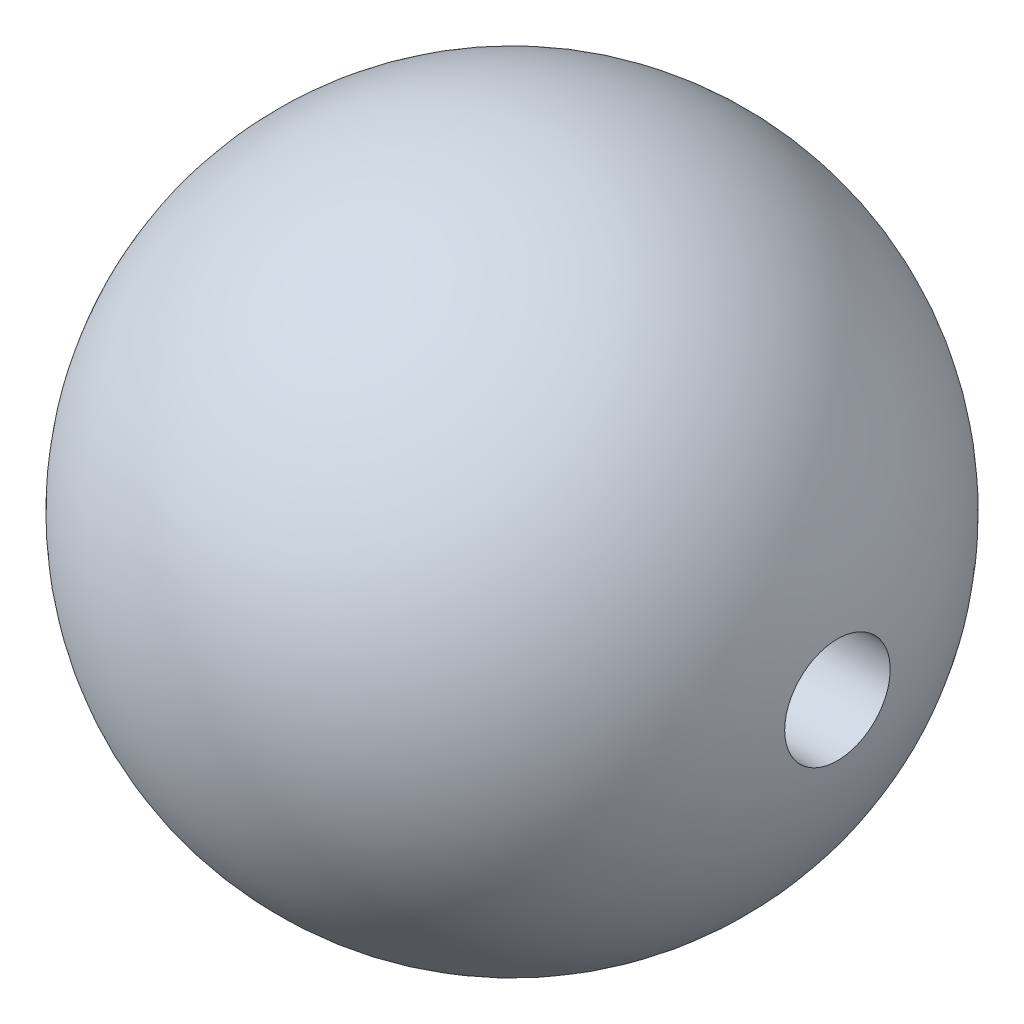
ISO-10303-21;
HEADER;
FILE_DESCRIPTION(('STEP AP214'),'2;1');
FILE_NAME('part.step','',(''),(''),'','','');
FILE_SCHEMA(('AUTOMOTIVE_DESIGN { 1 0 10303 214 1 1 1 1 }'));
ENDSEC;
DATA;
#1=APPLICATION_CONTEXT('core data for automotive mechanical design processes');
#2=APPLICATION_PROTOCOL_DEFINITION('international standard','automotive_design',2000,#1);
#3=PRODUCT_CONTEXT('',#1,'mechanical');
#4=PRODUCT('Part','Part','',(#3));
#5=PRODUCT_RELATED_PRODUCT_CATEGORY('part','',(#4));
#6=PRODUCT_DEFINITION_FORMATION('','',#4);
#7=PRODUCT_DEFINITION_CONTEXT('part definition',#1,'design');
#8=PRODUCT_DEFINITION('design','',#6,#7);
#9=PRODUCT_DEFINITION_SHAPE('','',#8);
#10=(LENGTH_UNIT() NAMED_UNIT(*) SI_UNIT(.MILLI.,.METRE.));
#11=(NAMED_UNIT(*) PLANE_ANGLE_UNIT() SI_UNIT($,.RADIAN.));
#12=(NAMED_UNIT(*) SI_UNIT($,.STERADIAN.) SOLID_ANGLE_UNIT());
#13=UNCERTAINTY_MEASURE_WITH_UNIT(LENGTH_MEASURE(1.E-05),#10,'distance_accuracy_value','');
#14=(GEOMETRIC_REPRESENTATION_CONTEXT(3) GLOBAL_UNCERTAINTY_ASSIGNED_CONTEXT((#13)) GLOBAL_UNIT_ASSIGNED_CONTEXT((#10,
#11,#12)) REPRESENTATION_CONTEXT('',''));
#15=CARTESIAN_POINT('',(0.,0.,0.));
#16=DIRECTION('',(0.,0.,1.));
#17=DIRECTION('',(1.,0.,0.));
#18=AXIS2_PLACEMENT_3D('',#15,#16,#17);
#19=CARTESIAN_POINT('',(0.,0.,0.));
#20=DIRECTION('',(0.,1.,0.));
#21=DIRECTION('',(1.,0.,0.));
#22=AXIS2_PLACEMENT_3D('',#19,#20,#21);
#23=SPHERICAL_SURFACE('',#22,25.);
#24=CARTESIAN_POINT('',(0.,0.,0.));
#25=DIRECTION('',(-1.,0.,0.));
#26=DIRECTION('',(0.,0.,1.));
#27=AXIS2_PLACEMENT_3D('',#24,#25,#26);
#28=SPHERICAL_SURFACE('',#27,25.);
#29=CARTESIAN_POINT('',(24.6779253585061,0.,0.));
#30=DIRECTION('',(-1.,0.,0.));
#31=DIRECTION('',(0.,0.,1.));
#32=AXIS2_PLACEMENT_3D('',#29,#30,#31);
#33=CIRCLE('',#32,4.);
#34=CARTESIAN_POINT('',(24.6779253585061,0.,4.));
#35=VERTEX_POINT('',#34);
#36=EDGE_CURVE('E10',#35,#35,#33,.T.);
#37=ORIENTED_EDGE('',*,*,#36,.T.);
#38=EDGE_LOOP('',(#37));
#39=FACE_BOUND('',#38,.T.);
#40=CARTESIAN_POINT('',(-24.6779253585061,0.,0.));
#41=DIRECTION('',(1.,0.,0.));
#42=DIRECTION('',(0.,0.,-1.));
#43=AXIS2_PLACEMENT_3D('',#40,#41,#42);
#44=CIRCLE('',#43,4.);
#45=CARTESIAN_POINT('',(-24.6779253585061,0.,-4.));
#46=VERTEX_POINT('',#45);
#47=EDGE_CURVE('E40',#46,#46,#44,.T.);
#48=ORIENTED_EDGE('',*,*,#47,.T.);
#49=EDGE_LOOP('',(#48));
#50=FACE_BOUND('',#49,.T.);
#51=ADVANCED_FACE('F34',(#39,#50),#28,.T.);
#52=CARTESIAN_POINT('',(-40.,0.,0.));
#53=DIRECTION('',(1.,0.,0.));
#54=DIRECTION('',(0.,0.,-1.));
#55=AXIS2_PLACEMENT_3D('',#52,#53,#54);
#56=CYLINDRICAL_SURFACE('',#55,4.);
#57=ORIENTED_EDGE('',*,*,#47,.F.);
#58=EDGE_LOOP('',(#57));
#59=FACE_BOUND('',#58,.T.);
#60=ORIENTED_EDGE('',*,*,#36,.F.);
#61=EDGE_LOOP('',(#60));
#62=FACE_BOUND('',#61,.T.);
#63=ADVANCED_FACE('F47',(#59,#62),#56,.F.);
#64=CLOSED_SHELL('',(#51,#63));
#65=MANIFOLD_SOLID_BREP('B2',#64);
#66=ADVANCED_BREP_SHAPE_REPRESENTATION('',(#18,#65),#14);
#67=SHAPE_DEFINITION_REPRESENTATION(#9,#66);
ENDSEC;
END-ISO-10303-21;
